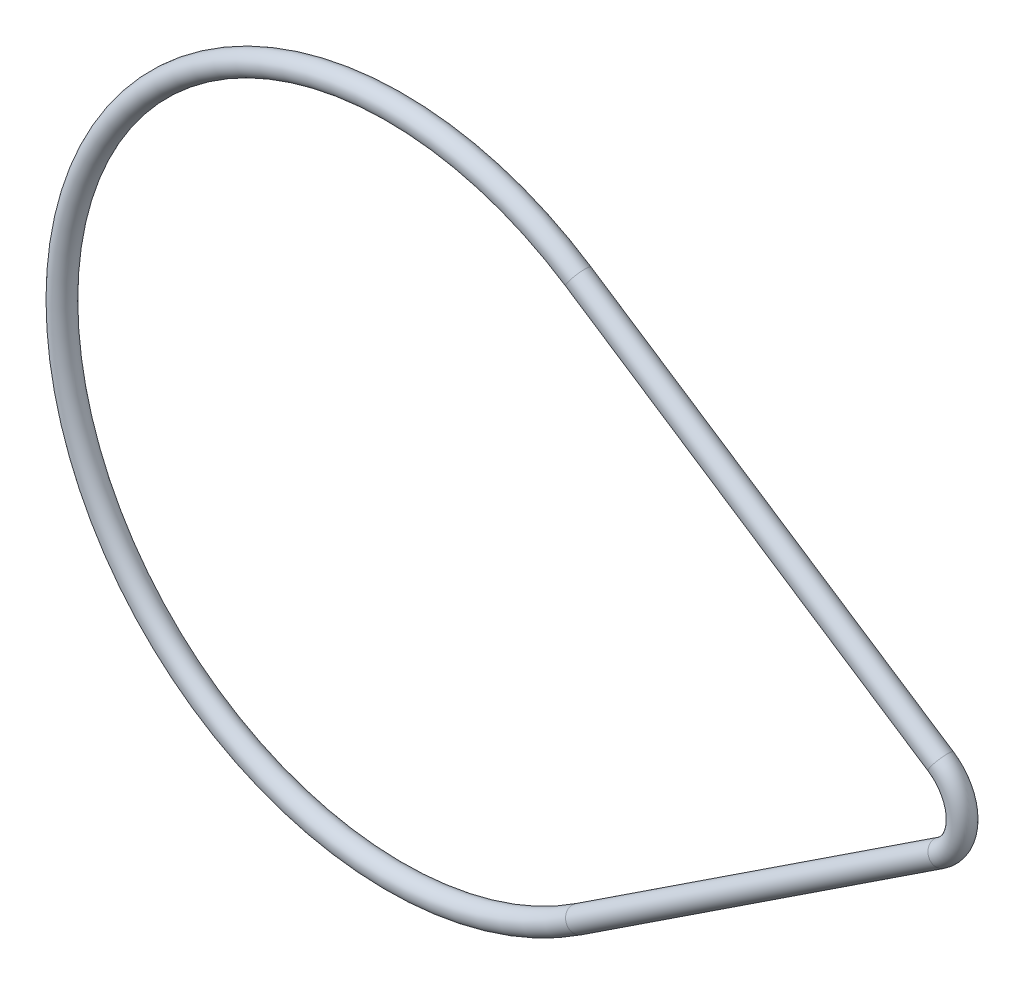
ISO-10303-21;
HEADER;
FILE_DESCRIPTION(('STEP AP214'),'2;1');
FILE_NAME('part.step','',(''),(''),'','','');
FILE_SCHEMA(('AUTOMOTIVE_DESIGN { 1 0 10303 214 1 1 1 1 }'));
ENDSEC;
DATA;
#1=APPLICATION_CONTEXT('core data for automotive mechanical design processes');
#2=APPLICATION_PROTOCOL_DEFINITION('international standard','automotive_design',2000,#1);
#3=PRODUCT_CONTEXT('',#1,'mechanical');
#4=PRODUCT('Part','Part','',(#3));
#5=PRODUCT_RELATED_PRODUCT_CATEGORY('part','',(#4));
#6=PRODUCT_DEFINITION_FORMATION('','',#4);
#7=PRODUCT_DEFINITION_CONTEXT('part definition',#1,'design');
#8=PRODUCT_DEFINITION('design','',#6,#7);
#9=PRODUCT_DEFINITION_SHAPE('','',#8);
#10=(LENGTH_UNIT() NAMED_UNIT(*) SI_UNIT(.MILLI.,.METRE.));
#11=(NAMED_UNIT(*) PLANE_ANGLE_UNIT() SI_UNIT($,.RADIAN.));
#12=(NAMED_UNIT(*) SI_UNIT($,.STERADIAN.) SOLID_ANGLE_UNIT());
#13=UNCERTAINTY_MEASURE_WITH_UNIT(LENGTH_MEASURE(1.E-05),#10,'distance_accuracy_value','');
#14=(GEOMETRIC_REPRESENTATION_CONTEXT(3) GLOBAL_UNCERTAINTY_ASSIGNED_CONTEXT((#13)) GLOBAL_UNIT_ASSIGNED_CONTEXT((#10,
#11,#12)) REPRESENTATION_CONTEXT('',''));
#15=CARTESIAN_POINT('',(0.,0.,0.));
#16=DIRECTION('',(0.,0.,1.));
#17=DIRECTION('',(1.,0.,0.));
#18=AXIS2_PLACEMENT_3D('',#15,#16,#17);
#19=CARTESIAN_POINT('',(16.22499999994,24.63735730556,0.));
#20=DIRECTION('',(0.835164654424502,-0.55,0.));
#21=DIRECTION('',(0.55,0.835164654424502,0.));
#22=AXIS2_PLACEMENT_3D('',#19,#20,#21);
#23=CYLINDRICAL_SURFACE('',#22,0.995);
#24=CARTESIAN_POINT('',(48.30999999994,3.507691548622,0.));
#25=DIRECTION('',(0.835164654433716,-0.549999999986011,0.));
#26=DIRECTION('',(0.549999999986011,0.835164654433716,0.));
#27=AXIS2_PLACEMENT_3D('',#24,#25,#26);
#28=CIRCLE('',#27,0.995);
#29=CARTESIAN_POINT('',(48.8572499999252,4.33868037978218,0.));
#30=VERTEX_POINT('',#29);
#31=EDGE_CURVE('E50',#30,#30,#28,.T.);
#32=CARTESIAN_POINT('',(16.22500000008,24.63735730547,0.));
#33=DIRECTION('',(-0.835164654422718,0.550000000002712,0.));
#34=DIRECTION('',(-0.550000000002712,-0.835164654422718,0.));
#35=AXIS2_PLACEMENT_3D('',#32,#33,#34);
#36=CIRCLE('',#35,0.995);
#37=CARTESIAN_POINT('',(16.7722500000817,25.4683461366191,0.));
#38=VERTEX_POINT('',#37);
#39=EDGE_CURVE('E47',#38,#38,#36,.T.);
#40=CARTESIAN_POINT('',(48.8572499999252,4.33868037978218,0.));
#41=CARTESIAN_POINT('',(48.5230312499268,4.55878106474923,0.));
#42=CARTESIAN_POINT('',(48.1888124999284,4.77888174971628,0.));
#43=CARTESIAN_POINT('',(47.5203749999317,5.21908311965038,0.));
#44=CARTESIAN_POINT('',(47.1861562499333,5.43918380461743,0.));
#45=CARTESIAN_POINT('',(46.5177187499366,5.87938517455153,0.));
#46=CARTESIAN_POINT('',(46.1834999999382,6.09948585951858,0.));
#47=CARTESIAN_POINT('',(45.5150624999415,6.53968722945269,0.));
#48=CARTESIAN_POINT('',(45.1808437499431,6.75978791441974,0.));
#49=CARTESIAN_POINT('',(44.5124062499464,7.19998928435384,0.));
#50=CARTESIAN_POINT('',(44.178187499948,7.42008996932089,0.));
#51=CARTESIAN_POINT('',(43.5097499999513,7.86029133925499,0.));
#52=CARTESIAN_POINT('',(43.1755312499529,8.08039202422204,0.));
#53=CARTESIAN_POINT('',(42.5070937499561,8.52059339415614,0.));
#54=CARTESIAN_POINT('',(42.1728749999578,8.7406940791232,0.));
#55=CARTESIAN_POINT('',(41.504437499961,9.1808954490573,0.));
#56=CARTESIAN_POINT('',(41.1702187499627,9.40099613402435,0.));
#57=CARTESIAN_POINT('',(40.5017812499659,9.84119750395845,0.));
#58=CARTESIAN_POINT('',(40.1675624999676,10.0612981889255,0.));
#59=CARTESIAN_POINT('',(39.4991249999708,10.5014995588596,0.));
#60=CARTESIAN_POINT('',(39.1649062499725,10.7216002438267,0.));
#61=CARTESIAN_POINT('',(38.4964687499757,11.1618016137608,0.));
#62=CARTESIAN_POINT('',(38.1622499999773,11.3819022987278,0.));
#63=CARTESIAN_POINT('',(37.4938124999806,11.8221036686619,0.));
#64=CARTESIAN_POINT('',(37.1595937499822,12.042204353629,0.));
#65=CARTESIAN_POINT('',(36.4911562499855,12.4824057235631,0.));
#66=CARTESIAN_POINT('',(36.1569374999871,12.7025064085301,0.));
#67=CARTESIAN_POINT('',(35.4884999999904,13.1427077784642,0.));
#68=CARTESIAN_POINT('',(35.154281249992,13.3628084634313,0.));
#69=CARTESIAN_POINT('',(34.4858437499953,13.8030098333654,0.));
#70=CARTESIAN_POINT('',(34.1516249999969,14.0231105183324,0.));
#71=CARTESIAN_POINT('',(33.4831875000002,14.4633118882665,0.));
#72=CARTESIAN_POINT('',(33.1489687500018,14.6834125732336,0.));
#73=CARTESIAN_POINT('',(32.4805312500051,15.1236139431677,0.));
#74=CARTESIAN_POINT('',(32.1463125000067,15.3437146281347,0.));
#75=CARTESIAN_POINT('',(31.47787500001,15.7839159980688,0.));
#76=CARTESIAN_POINT('',(31.1436562500116,16.0040166830359,0.));
#77=CARTESIAN_POINT('',(30.4752187500148,16.44421805297,0.));
#78=CARTESIAN_POINT('',(30.1410000000165,16.664318737937,0.));
#79=CARTESIAN_POINT('',(29.4725625000197,17.1045201078711,0.));
#80=CARTESIAN_POINT('',(29.1383437500214,17.3246207928382,0.));
#81=CARTESIAN_POINT('',(28.4699062500246,17.7648221627723,0.));
#82=CARTESIAN_POINT('',(28.1356875000263,17.9849228477393,0.));
#83=CARTESIAN_POINT('',(27.4672500000295,18.4251242176734,0.));
#84=CARTESIAN_POINT('',(27.1330312500311,18.6452249026405,0.));
#85=CARTESIAN_POINT('',(26.4645937500344,19.0854262725746,0.));
#86=CARTESIAN_POINT('',(26.130375000036,19.3055269575416,0.));
#87=CARTESIAN_POINT('',(25.4619375000393,19.7457283274757,0.));
#88=CARTESIAN_POINT('',(25.1277187500409,19.9658290124428,0.));
#89=CARTESIAN_POINT('',(24.4592812500442,20.4060303823769,0.));
#90=CARTESIAN_POINT('',(24.1250625000458,20.6261310673439,0.));
#91=CARTESIAN_POINT('',(23.4566250000491,21.066332437278,0.));
#92=CARTESIAN_POINT('',(23.1224062500507,21.2864331222451,0.));
#93=CARTESIAN_POINT('',(22.453968750054,21.7266344921792,0.));
#94=CARTESIAN_POINT('',(22.1197500000556,21.9467351771463,0.));
#95=CARTESIAN_POINT('',(21.4513125000589,22.3869365470804,0.));
#96=CARTESIAN_POINT('',(21.1170937500605,22.6070372320474,0.));
#97=CARTESIAN_POINT('',(20.4486562500638,23.0472386019815,0.));
#98=CARTESIAN_POINT('',(20.1144375000654,23.2673392869486,0.));
#99=CARTESIAN_POINT('',(19.4460000000686,23.7075406568827,0.));
#100=CARTESIAN_POINT('',(19.1117812500703,23.9276413418497,0.));
#101=CARTESIAN_POINT('',(18.4433437500735,24.3678427117838,0.));
#102=CARTESIAN_POINT('',(18.1091250000752,24.5879433967509,0.));
#103=CARTESIAN_POINT('',(17.4406875000784,25.028144766685,0.));
#104=CARTESIAN_POINT('',(17.1064687500801,25.248245451652,0.));
#105=CARTESIAN_POINT('',(16.7722500000817,25.4683461366191,0.));
#106=B_SPLINE_CURVE_WITH_KNOTS('',3,(#40,#41,#42,#43,#44,#45,#46,#47,#48,#49,#50,#51,#52,#53,
#54,#55,#56,#57,#58,#59,#60,#61,#62,#63,#64,#65,#66,#67,#68,#69,#70,#71,#72,#73,#74,#75,#76,#77,
#78,#79,#80,#81,#82,#83,#84,#85,#86,#87,#88,#89,#90,#91,#92,#93,#94,#95,#96,#97,#98,#99,#100,
#101,#102,#103,#104,#105),.UNSPECIFIED.,.F.,.F.,(4,2,2,2,2,2,2,2,2,2,2,2,2,2,2,2,2,2,2,2,2,2,2,
2,2,2,2,2,2,2,2,2,4),(0.,1.20054919072937,2.40109838145874,3.60164757218811,4.80219676291747,
6.00274595364684,7.20329514437621,8.40384433510558,9.60439352583494,10.8049427165643,
12.0054919072937,13.206041098023,14.4065902887524,15.6071394794818,16.8076886702112,
18.0082378609405,19.2087870516699,20.4093362423993,21.6098854331286,22.810434623858,
24.0109838145874,25.2115330053167,26.4120821960461,27.6126313867755,28.8131805775048,
30.0137297682342,31.2142789589636,32.4148281496929,33.6153773404223,34.8159265311517,
36.016475721881,37.2170249126104,38.4175741033398),.UNSPECIFIED.);
#107=EDGE_CURVE('BSEAM17',#30,#38,#106,.T.);
#108=ORIENTED_EDGE('',*,*,#31,.F.);
#109=ORIENTED_EDGE('',*,*,#39,.F.);
#110=ORIENTED_EDGE('',*,*,#107,.T.);
#111=ORIENTED_EDGE('',*,*,#107,.F.);
#112=EDGE_LOOP('',(#108,#110,#109,#111));
#113=FACE_BOUND('',#112,.T.);
#114=ADVANCED_FACE('F17',(#113),#23,.T.);
#115=CARTESIAN_POINT('',(0.,0.,0.));
#116=DIRECTION('',(0.,0.,-1.));
#117=DIRECTION('',(-1.,0.,0.));
#118=AXIS2_PLACEMENT_3D('',#115,#116,#117);
#119=TOROIDAL_SURFACE('',#118,29.5,0.995);
#120=CARTESIAN_POINT('',(16.22500000006,-24.63735730548,0.));
#121=DIRECTION('',(-0.83516465442319,-0.550000000001994,0.));
#122=DIRECTION('',(-0.550000000001994,0.83516465442319,0.));
#123=AXIS2_PLACEMENT_3D('',#120,#121,#122);
#124=CIRCLE('',#123,0.995);
#125=CARTESIAN_POINT('',(16.7722500000636,-25.4683461366333,0.));
#126=VERTEX_POINT('',#125);
#127=EDGE_CURVE('E59',#126,#126,#124,.T.);
#128=CARTESIAN_POINT('',(0.,0.,0.));
#129=DIRECTION('',(0.,0.,-1.));
#130=DIRECTION('',(-1.,0.,0.));
#131=AXIS2_PLACEMENT_3D('',#128,#129,#130);
#132=CIRCLE('',#131,30.495);
#133=EDGE_CURVE('',#126,#38,#132,.T.);
#134=ORIENTED_EDGE('',*,*,#127,.T.);
#135=ORIENTED_EDGE('',*,*,#39,.T.);
#136=ORIENTED_EDGE('',*,*,#133,.T.);
#137=ORIENTED_EDGE('',*,*,#133,.F.);
#138=EDGE_LOOP('',(#134,#136,#135,#137));
#139=FACE_BOUND('',#138,.T.);
#140=ADVANCED_FACE('F80',(#139),#119,.T.);
#141=CARTESIAN_POINT('',(16.22500000006,-24.63735730548,0.));
#142=DIRECTION('',(0.835164654424502,0.55,0.));
#143=DIRECTION('',(-0.55,0.835164654424502,0.));
#144=AXIS2_PLACEMENT_3D('',#141,#142,#143);
#145=CYLINDRICAL_SURFACE('',#144,0.995);
#146=CARTESIAN_POINT('',(48.31000000006,-3.507691548543,0.));
#147=DIRECTION('',(0.83516465441509,0.550000000014294,0.));
#148=DIRECTION('',(0.550000000014294,-0.83516465441509,0.));
#149=AXIS2_PLACEMENT_3D('',#146,#147,#148);
#150=CIRCLE('',#149,0.995);
#151=CARTESIAN_POINT('',(48.8572500000744,-4.33868037968627,0.));
#152=VERTEX_POINT('',#151);
#153=EDGE_CURVE('E66',#152,#152,#150,.T.);
#154=ORIENTED_EDGE('',*,*,#153,.F.);
#155=EDGE_LOOP('',(#154));
#156=FACE_BOUND('',#155,.T.);
#157=ORIENTED_EDGE('',*,*,#127,.F.);
#158=EDGE_LOOP('',(#157));
#159=FACE_BOUND('',#158,.T.);
#160=ADVANCED_FACE('F77',(#156,#159),#145,.T.);
#161=CARTESIAN_POINT('',(46.,0.,0.));
#162=DIRECTION('',(0.,0.,1.));
#163=DIRECTION('',(1.,0.,0.));
#164=AXIS2_PLACEMENT_3D('',#161,#162,#163);
#165=TOROIDAL_SURFACE('',#164,4.2,0.995);
#166=CARTESIAN_POINT('',(46.,0.,0.));
#167=DIRECTION('',(0.,0.,1.));
#168=DIRECTION('',(1.,0.,0.));
#169=AXIS2_PLACEMENT_3D('',#166,#167,#168);
#170=CIRCLE('',#169,5.195);
#171=EDGE_CURVE('',#152,#30,#170,.T.);
#172=ORIENTED_EDGE('',*,*,#153,.T.);
#173=ORIENTED_EDGE('',*,*,#31,.T.);
#174=ORIENTED_EDGE('',*,*,#171,.T.);
#175=ORIENTED_EDGE('',*,*,#171,.F.);
#176=EDGE_LOOP('',(#172,#174,#173,#175));
#177=FACE_BOUND('',#176,.T.);
#178=ADVANCED_FACE('F75',(#177),#165,.T.);
#179=CLOSED_SHELL('',(#114,#140,#160,#178));
#180=CARTESIAN_POINT('',(16.22500000006,-24.63735730548,0.));
#181=DIRECTION('',(0.835164654424502,0.55,0.));
#182=DIRECTION('',(-0.55,0.835164654424502,0.));
#183=AXIS2_PLACEMENT_3D('',#180,#181,#182);
#184=CYLINDRICAL_SURFACE('',#183,0.1);
#185=CARTESIAN_POINT('',(48.31000000006,-3.507691548544,0.));
#186=DIRECTION('',(-0.835164654415289,-0.550000000013993,0.));
#187=DIRECTION('',(0.550000000013992,-0.835164654415289,0.));
#188=AXIS2_PLACEMENT_3D('',#185,#186,#187);
#189=CIRCLE('',#188,0.1);
#190=CARTESIAN_POINT('',(48.3650000000611,-3.5912080139851,0.));
#191=VERTEX_POINT('',#190);
#192=EDGE_CURVE('E26',#191,#191,#189,.T.);
#193=ORIENTED_EDGE('',*,*,#192,.F.);
#194=EDGE_LOOP('',(#193));
#195=FACE_BOUND('',#194,.T.);
#196=CARTESIAN_POINT('',(16.22500000006,-24.63735730548,0.));
#197=DIRECTION('',(0.83516465442319,0.550000000001994,0.));
#198=DIRECTION('',(-0.550000000001994,0.83516465442319,0.));
#199=AXIS2_PLACEMENT_3D('',#196,#197,#198);
#200=CIRCLE('',#199,0.1);
#201=CARTESIAN_POINT('',(16.2800000000617,-24.7208737709246,0.));
#202=VERTEX_POINT('',#201);
#203=EDGE_CURVE('E10',#202,#202,#200,.T.);
#204=ORIENTED_EDGE('',*,*,#203,.F.);
#205=EDGE_LOOP('',(#204));
#206=FACE_BOUND('',#205,.T.);
#207=ADVANCED_FACE('F19',(#195,#206),#184,.F.);
#208=CARTESIAN_POINT('',(0.,0.,0.));
#209=DIRECTION('',(0.,0.,-1.));
#210=DIRECTION('',(-1.,0.,0.));
#211=AXIS2_PLACEMENT_3D('',#208,#209,#210);
#212=TOROIDAL_SURFACE('',#211,29.5,0.1);
#213=CARTESIAN_POINT('',(16.22500000008,24.63735730547,0.));
#214=DIRECTION('',(0.835164654422718,-0.550000000002712,0.));
#215=DIRECTION('',(-0.550000000002712,-0.835164654422718,0.));
#216=AXIS2_PLACEMENT_3D('',#213,#214,#215);
#217=CIRCLE('',#216,0.1);
#218=CARTESIAN_POINT('',(16.2800000000803,24.7208737709124,0.));
#219=VERTEX_POINT('',#218);
#220=EDGE_CURVE('E35',#219,#219,#217,.T.);
#221=CARTESIAN_POINT('',(0.,0.,0.));
#222=DIRECTION('',(0.,0.,-1.));
#223=DIRECTION('',(-1.,0.,0.));
#224=AXIS2_PLACEMENT_3D('',#221,#222,#223);
#225=CIRCLE('',#224,29.6);
#226=EDGE_CURVE('',#202,#219,#225,.T.);
#227=ORIENTED_EDGE('',*,*,#203,.T.);
#228=ORIENTED_EDGE('',*,*,#220,.T.);
#229=ORIENTED_EDGE('',*,*,#226,.T.);
#230=ORIENTED_EDGE('',*,*,#226,.F.);
#231=EDGE_LOOP('',(#227,#229,#228,#230));
#232=FACE_BOUND('',#231,.T.);
#233=ADVANCED_FACE('F94',(#232),#212,.F.);
#234=CARTESIAN_POINT('',(16.22499999994,24.63735730556,0.));
#235=DIRECTION('',(0.835164654424502,-0.55,0.));
#236=DIRECTION('',(0.55,0.835164654424502,0.));
#237=AXIS2_PLACEMENT_3D('',#234,#235,#236);
#238=CYLINDRICAL_SURFACE('',#237,0.1);
#239=CARTESIAN_POINT('',(48.30999999994,3.507691548621,0.));
#240=DIRECTION('',(-0.835164654433518,0.549999999986312,0.));
#241=DIRECTION('',(0.549999999986312,0.835164654433518,0.));
#242=AXIS2_PLACEMENT_3D('',#239,#240,#241);
#243=CIRCLE('',#242,0.1);
#244=CARTESIAN_POINT('',(48.3649999999392,3.59120801406538,0.));
#245=VERTEX_POINT('',#244);
#246=EDGE_CURVE('E43',#245,#245,#243,.T.);
#247=ORIENTED_EDGE('',*,*,#246,.F.);
#248=EDGE_LOOP('',(#247));
#249=FACE_BOUND('',#248,.T.);
#250=ORIENTED_EDGE('',*,*,#220,.F.);
#251=EDGE_LOOP('',(#250));
#252=FACE_BOUND('',#251,.T.);
#253=ADVANCED_FACE('F96',(#249,#252),#238,.F.);
#254=CARTESIAN_POINT('',(46.,0.,0.));
#255=DIRECTION('',(0.,0.,1.));
#256=DIRECTION('',(1.,0.,0.));
#257=AXIS2_PLACEMENT_3D('',#254,#255,#256);
#258=TOROIDAL_SURFACE('',#257,4.2,0.1);
#259=CARTESIAN_POINT('',(46.,0.,0.));
#260=DIRECTION('',(0.,0.,1.));
#261=DIRECTION('',(1.,0.,0.));
#262=AXIS2_PLACEMENT_3D('',#259,#260,#261);
#263=CIRCLE('',#262,4.3);
#264=EDGE_CURVE('',#191,#245,#263,.T.);
#265=ORIENTED_EDGE('',*,*,#192,.T.);
#266=ORIENTED_EDGE('',*,*,#246,.T.);
#267=ORIENTED_EDGE('',*,*,#264,.T.);
#268=ORIENTED_EDGE('',*,*,#264,.F.);
#269=EDGE_LOOP('',(#265,#267,#266,#268));
#270=FACE_BOUND('',#269,.T.);
#271=ADVANCED_FACE('F100',(#270),#258,.F.);
#272=CLOSED_SHELL('',(#207,#233,#253,#271));
#273=ORIENTED_CLOSED_SHELL('',*,#272,.T.);
#274=BREP_WITH_VOIDS('B1',#179,(#273));
#275=ADVANCED_BREP_SHAPE_REPRESENTATION('',(#18,#274),#14);
#276=SHAPE_DEFINITION_REPRESENTATION(#9,#275);
ENDSEC;
END-ISO-10303-21;
